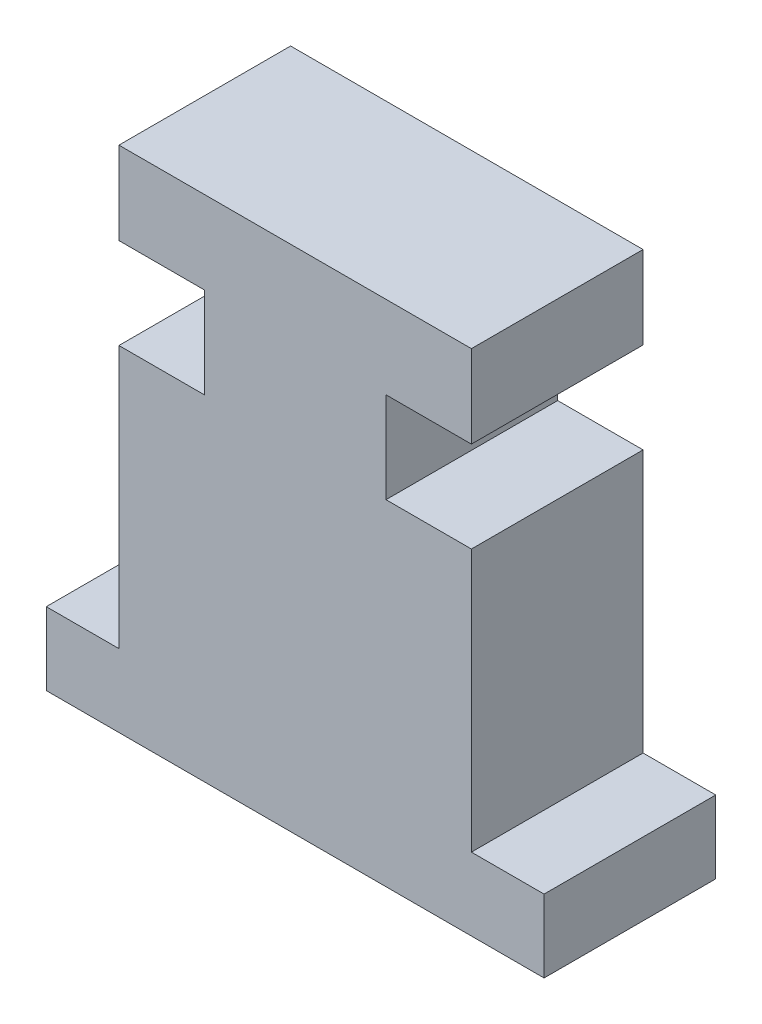
ISO-10303-21;
HEADER;
FILE_DESCRIPTION(('STEP AP214'),'2;1');
FILE_NAME('part.step','',(''),(''),'','','');
FILE_SCHEMA(('AUTOMOTIVE_DESIGN { 1 0 10303 214 1 1 1 1 }'));
ENDSEC;
DATA;
#1=APPLICATION_CONTEXT('core data for automotive mechanical design processes');
#2=APPLICATION_PROTOCOL_DEFINITION('international standard','automotive_design',2000,#1);
#3=PRODUCT_CONTEXT('',#1,'mechanical');
#4=PRODUCT('Part','Part','',(#3));
#5=PRODUCT_RELATED_PRODUCT_CATEGORY('part','',(#4));
#6=PRODUCT_DEFINITION_FORMATION('','',#4);
#7=PRODUCT_DEFINITION_CONTEXT('part definition',#1,'design');
#8=PRODUCT_DEFINITION('design','',#6,#7);
#9=PRODUCT_DEFINITION_SHAPE('','',#8);
#10=(LENGTH_UNIT() NAMED_UNIT(*) SI_UNIT(.MILLI.,.METRE.));
#11=(NAMED_UNIT(*) PLANE_ANGLE_UNIT() SI_UNIT($,.RADIAN.));
#12=(NAMED_UNIT(*) SI_UNIT($,.STERADIAN.) SOLID_ANGLE_UNIT());
#13=UNCERTAINTY_MEASURE_WITH_UNIT(LENGTH_MEASURE(1.E-05),#10,'distance_accuracy_value','');
#14=(GEOMETRIC_REPRESENTATION_CONTEXT(3) GLOBAL_UNCERTAINTY_ASSIGNED_CONTEXT((#13)) GLOBAL_UNIT_ASSIGNED_CONTEXT((#10,
#11,#12)) REPRESENTATION_CONTEXT('',''));
#15=CARTESIAN_POINT('',(0.,0.,0.));
#16=DIRECTION('',(0.,0.,1.));
#17=DIRECTION('',(1.,0.,0.));
#18=AXIS2_PLACEMENT_3D('',#15,#16,#17);
#19=CARTESIAN_POINT('',(6.1595,15.24,0.));
#20=DIRECTION('',(1.,0.,0.));
#21=DIRECTION('',(0.,0.,-1.));
#22=AXIS2_PLACEMENT_3D('',#19,#20,#21);
#23=PLANE('',#22);
#24=DIRECTION('',(0.,-1.,0.));
#25=VECTOR('',#24,1.);
#26=CARTESIAN_POINT('',(6.1595,15.24,3.));
#27=LINE('',#26,#25);
#28=CARTESIAN_POINT('',(6.1595,15.24,3.));
#29=VERTEX_POINT('',#28);
#30=CARTESIAN_POINT('',(6.1595,12.35,3.));
#31=VERTEX_POINT('',#30);
#32=EDGE_CURVE('E308',#29,#31,#27,.T.);
#33=ORIENTED_EDGE('',*,*,#32,.T.);
#34=DIRECTION('',(0.,0.,-1.));
#35=VECTOR('',#34,1.);
#36=CARTESIAN_POINT('',(6.1595,12.35,3.));
#37=LINE('',#36,#35);
#38=CARTESIAN_POINT('',(6.1595,12.35,-3.));
#39=VERTEX_POINT('',#38);
#40=EDGE_CURVE('E73',#31,#39,#37,.T.);
#41=ORIENTED_EDGE('',*,*,#40,.T.);
#42=DIRECTION('',(0.,-1.,0.));
#43=VECTOR('',#42,1.);
#44=CARTESIAN_POINT('',(6.1595,15.24,-3.));
#45=LINE('',#44,#43);
#46=CARTESIAN_POINT('',(6.1595,15.24,-3.));
#47=VERTEX_POINT('',#46);
#48=EDGE_CURVE('E11',#47,#39,#45,.T.);
#49=ORIENTED_EDGE('',*,*,#48,.F.);
#50=DIRECTION('',(0.,0.,1.));
#51=VECTOR('',#50,1.);
#52=CARTESIAN_POINT('',(6.1595,15.24,0.));
#53=LINE('',#52,#51);
#54=EDGE_CURVE('E286',#47,#29,#53,.T.);
#55=ORIENTED_EDGE('',*,*,#54,.T.);
#56=EDGE_LOOP('',(#33,#41,#49,#55));
#57=FACE_BOUND('',#56,.T.);
#58=ADVANCED_FACE('F49',(#57),#23,.T.);
#59=CARTESIAN_POINT('',(0.,15.24,-3.));
#60=DIRECTION('',(0.,0.,-1.));
#61=DIRECTION('',(-1.,0.,0.));
#62=AXIS2_PLACEMENT_3D('',#59,#60,#61);
#63=PLANE('',#62);
#64=DIRECTION('',(-1.,0.,0.));
#65=VECTOR('',#64,1.);
#66=CARTESIAN_POINT('',(0.,9.175,-3.));
#67=LINE('',#66,#65);
#68=CARTESIAN_POINT('',(6.1595,9.175,-3.));
#69=VERTEX_POINT('',#68);
#70=CARTESIAN_POINT('',(3.175,9.175,-3.));
#71=VERTEX_POINT('',#70);
#72=EDGE_CURVE('E185',#69,#71,#67,.T.);
#73=ORIENTED_EDGE('',*,*,#72,.F.);
#74=CARTESIAN_POINT('',(6.1595,0.,-3.));
#75=VERTEX_POINT('',#74);
#76=EDGE_CURVE('E58',#69,#75,#45,.T.);
#77=ORIENTED_EDGE('',*,*,#76,.T.);
#78=DIRECTION('',(1.,0.,0.));
#79=VECTOR('',#78,1.);
#80=CARTESIAN_POINT('',(0.,0.,-3.));
#81=LINE('',#80,#79);
#82=CARTESIAN_POINT('',(8.6995,0.,-3.));
#83=VERTEX_POINT('',#82);
#84=EDGE_CURVE('E264',#75,#83,#81,.T.);
#85=ORIENTED_EDGE('',*,*,#84,.T.);
#86=DIRECTION('',(0.,1.,0.));
#87=VECTOR('',#86,1.);
#88=CARTESIAN_POINT('',(8.6995,-2.54,-3.));
#89=LINE('',#88,#87);
#90=CARTESIAN_POINT('',(8.6995,-2.54,-3.));
#91=VERTEX_POINT('',#90);
#92=EDGE_CURVE('E279',#91,#83,#89,.T.);
#93=ORIENTED_EDGE('',*,*,#92,.F.);
#94=DIRECTION('',(1.,0.,0.));
#95=VECTOR('',#94,1.);
#96=CARTESIAN_POINT('',(0.,-2.54,-3.));
#97=LINE('',#96,#95);
#98=CARTESIAN_POINT('',(-8.6995,-2.54,-3.));
#99=VERTEX_POINT('',#98);
#100=EDGE_CURVE('E248',#99,#91,#97,.T.);
#101=ORIENTED_EDGE('',*,*,#100,.F.);
#102=DIRECTION('',(0.,1.,0.));
#103=VECTOR('',#102,1.);
#104=CARTESIAN_POINT('',(-8.6995,-2.54,-3.));
#105=LINE('',#104,#103);
#106=CARTESIAN_POINT('',(-8.6995,0.,-3.));
#107=VERTEX_POINT('',#106);
#108=EDGE_CURVE('E276',#99,#107,#105,.T.);
#109=ORIENTED_EDGE('',*,*,#108,.T.);
#110=CARTESIAN_POINT('',(-6.1595,0.,-3.));
#111=VERTEX_POINT('',#110);
#112=EDGE_CURVE('E265',#107,#111,#81,.T.);
#113=ORIENTED_EDGE('',*,*,#112,.T.);
#114=DIRECTION('',(0.,-1.,0.));
#115=VECTOR('',#114,1.);
#116=CARTESIAN_POINT('',(-6.1595,15.24,-3.));
#117=LINE('',#116,#115);
#118=CARTESIAN_POINT('',(-6.1595,9.175,-3.));
#119=VERTEX_POINT('',#118);
#120=EDGE_CURVE('E315',#119,#111,#117,.T.);
#121=ORIENTED_EDGE('',*,*,#120,.F.);
#122=DIRECTION('',(-1.,0.,0.));
#123=VECTOR('',#122,1.);
#124=CARTESIAN_POINT('',(0.,9.175,-3.));
#125=LINE('',#124,#123);
#126=CARTESIAN_POINT('',(-3.175,9.175,-3.));
#127=VERTEX_POINT('',#126);
#128=EDGE_CURVE('E212',#127,#119,#125,.T.);
#129=ORIENTED_EDGE('',*,*,#128,.F.);
#130=DIRECTION('',(0.,-1.,0.));
#131=VECTOR('',#130,1.);
#132=CARTESIAN_POINT('',(-3.17500000000001,0.,-3.));
#133=LINE('',#132,#131);
#134=CARTESIAN_POINT('',(-3.175,12.35,-3.));
#135=VERTEX_POINT('',#134);
#136=EDGE_CURVE('E223',#135,#127,#133,.T.);
#137=ORIENTED_EDGE('',*,*,#136,.F.);
#138=DIRECTION('',(-1.,0.,0.));
#139=VECTOR('',#138,1.);
#140=CARTESIAN_POINT('',(0.,12.35,-3.));
#141=LINE('',#140,#139);
#142=CARTESIAN_POINT('',(-6.1595,12.35,-3.));
#143=VERTEX_POINT('',#142);
#144=EDGE_CURVE('E219',#135,#143,#141,.T.);
#145=ORIENTED_EDGE('',*,*,#144,.T.);
#146=CARTESIAN_POINT('',(-6.1595,15.24,-3.));
#147=VERTEX_POINT('',#146);
#148=EDGE_CURVE('E316',#147,#143,#117,.T.);
#149=ORIENTED_EDGE('',*,*,#148,.F.);
#150=DIRECTION('',(1.,0.,0.));
#151=VECTOR('',#150,1.);
#152=CARTESIAN_POINT('',(0.,15.24,-3.));
#153=LINE('',#152,#151);
#154=EDGE_CURVE('E290',#147,#47,#153,.T.);
#155=ORIENTED_EDGE('',*,*,#154,.T.);
#156=ORIENTED_EDGE('',*,*,#48,.T.);
#157=DIRECTION('',(-1.,0.,0.));
#158=VECTOR('',#157,1.);
#159=CARTESIAN_POINT('',(0.,12.35,-3.));
#160=LINE('',#159,#158);
#161=CARTESIAN_POINT('',(3.175,12.35,-3.));
#162=VERTEX_POINT('',#161);
#163=EDGE_CURVE('E189',#39,#162,#160,.T.);
#164=ORIENTED_EDGE('',*,*,#163,.T.);
#165=DIRECTION('',(0.,-1.,0.));
#166=VECTOR('',#165,1.);
#167=CARTESIAN_POINT('',(3.175,0.,-3.));
#168=LINE('',#167,#166);
#169=EDGE_CURVE('E177',#162,#71,#168,.T.);
#170=ORIENTED_EDGE('',*,*,#169,.T.);
#171=EDGE_LOOP('',(#73,#77,#85,#93,#101,#109,#113,#121,#129,#137,#145,#149,#155,#156,#164,#170));
#172=FACE_BOUND('',#171,.T.);
#173=ADVANCED_FACE('F337',(#172),#63,.T.);
#174=CARTESIAN_POINT('',(-6.1595,15.24,0.));
#175=DIRECTION('',(1.,0.,0.));
#176=DIRECTION('',(0.,0.,-1.));
#177=AXIS2_PLACEMENT_3D('',#174,#175,#176);
#178=PLANE('',#177);
#179=DIRECTION('',(0.,0.,-1.));
#180=VECTOR('',#179,1.);
#181=CARTESIAN_POINT('',(-6.1595,12.35,3.));
#182=LINE('',#181,#180);
#183=CARTESIAN_POINT('',(-6.1595,12.35,3.));
#184=VERTEX_POINT('',#183);
#185=EDGE_CURVE('E196',#184,#143,#182,.T.);
#186=ORIENTED_EDGE('',*,*,#185,.F.);
#187=DIRECTION('',(0.,-1.,0.));
#188=VECTOR('',#187,1.);
#189=CARTESIAN_POINT('',(-6.1595,15.24,3.));
#190=LINE('',#189,#188);
#191=CARTESIAN_POINT('',(-6.1595,15.24,3.));
#192=VERTEX_POINT('',#191);
#193=EDGE_CURVE('E312',#192,#184,#190,.T.);
#194=ORIENTED_EDGE('',*,*,#193,.F.);
#195=DIRECTION('',(0.,0.,1.));
#196=VECTOR('',#195,1.);
#197=CARTESIAN_POINT('',(-6.1595,15.24,0.));
#198=LINE('',#197,#196);
#199=EDGE_CURVE('E295',#147,#192,#198,.T.);
#200=ORIENTED_EDGE('',*,*,#199,.F.);
#201=ORIENTED_EDGE('',*,*,#148,.T.);
#202=EDGE_LOOP('',(#186,#194,#200,#201));
#203=FACE_BOUND('',#202,.T.);
#204=ADVANCED_FACE('F371',(#203),#178,.F.);
#205=CARTESIAN_POINT('',(0.,15.24,3.));
#206=DIRECTION('',(0.,0.,-1.));
#207=DIRECTION('',(-1.,0.,0.));
#208=AXIS2_PLACEMENT_3D('',#205,#206,#207);
#209=PLANE('',#208);
#210=CARTESIAN_POINT('',(6.1595,9.175,3.));
#211=VERTEX_POINT('',#210);
#212=CARTESIAN_POINT('',(6.1595,0.,3.));
#213=VERTEX_POINT('',#212);
#214=EDGE_CURVE('E301',#211,#213,#27,.T.);
#215=ORIENTED_EDGE('',*,*,#214,.F.);
#216=DIRECTION('',(-1.,0.,0.));
#217=VECTOR('',#216,1.);
#218=CARTESIAN_POINT('',(0.,9.175,3.));
#219=LINE('',#218,#217);
#220=CARTESIAN_POINT('',(3.175,9.175,3.));
#221=VERTEX_POINT('',#220);
#222=EDGE_CURVE('E170',#211,#221,#219,.T.);
#223=ORIENTED_EDGE('',*,*,#222,.T.);
#224=DIRECTION('',(0.,-1.,0.));
#225=VECTOR('',#224,1.);
#226=CARTESIAN_POINT('',(3.175,0.,3.));
#227=LINE('',#226,#225);
#228=CARTESIAN_POINT('',(3.175,12.35,3.));
#229=VERTEX_POINT('',#228);
#230=EDGE_CURVE('E171',#229,#221,#227,.T.);
#231=ORIENTED_EDGE('',*,*,#230,.F.);
#232=DIRECTION('',(-1.,0.,0.));
#233=VECTOR('',#232,1.);
#234=CARTESIAN_POINT('',(0.,12.35,3.));
#235=LINE('',#234,#233);
#236=EDGE_CURVE('E160',#31,#229,#235,.T.);
#237=ORIENTED_EDGE('',*,*,#236,.F.);
#238=ORIENTED_EDGE('',*,*,#32,.F.);
#239=DIRECTION('',(1.,0.,0.));
#240=VECTOR('',#239,1.);
#241=CARTESIAN_POINT('',(0.,15.24,3.));
#242=LINE('',#241,#240);
#243=EDGE_CURVE('E298',#192,#29,#242,.T.);
#244=ORIENTED_EDGE('',*,*,#243,.F.);
#245=ORIENTED_EDGE('',*,*,#193,.T.);
#246=DIRECTION('',(-1.,0.,0.));
#247=VECTOR('',#246,1.);
#248=CARTESIAN_POINT('',(0.,12.35,3.));
#249=LINE('',#248,#247);
#250=CARTESIAN_POINT('',(-3.175,12.35,3.));
#251=VERTEX_POINT('',#250);
#252=EDGE_CURVE('E208',#251,#184,#249,.T.);
#253=ORIENTED_EDGE('',*,*,#252,.F.);
#254=DIRECTION('',(0.,-1.,0.));
#255=VECTOR('',#254,1.);
#256=CARTESIAN_POINT('',(-3.17500000000001,0.,3.));
#257=LINE('',#256,#255);
#258=CARTESIAN_POINT('',(-3.175,9.175,3.));
#259=VERTEX_POINT('',#258);
#260=EDGE_CURVE('E211',#251,#259,#257,.T.);
#261=ORIENTED_EDGE('',*,*,#260,.T.);
#262=DIRECTION('',(-1.,0.,0.));
#263=VECTOR('',#262,1.);
#264=CARTESIAN_POINT('',(0.,9.175,3.));
#265=LINE('',#264,#263);
#266=CARTESIAN_POINT('',(-6.1595,9.175,3.));
#267=VERTEX_POINT('',#266);
#268=EDGE_CURVE('E65',#259,#267,#265,.T.);
#269=ORIENTED_EDGE('',*,*,#268,.T.);
#270=CARTESIAN_POINT('',(-6.1595,0.,3.));
#271=VERTEX_POINT('',#270);
#272=EDGE_CURVE('E311',#267,#271,#190,.T.);
#273=ORIENTED_EDGE('',*,*,#272,.T.);
#274=DIRECTION('',(1.,0.,0.));
#275=VECTOR('',#274,1.);
#276=CARTESIAN_POINT('',(0.,0.,3.));
#277=LINE('',#276,#275);
#278=CARTESIAN_POINT('',(-8.6995,0.,3.));
#279=VERTEX_POINT('',#278);
#280=EDGE_CURVE('E256',#279,#271,#277,.T.);
#281=ORIENTED_EDGE('',*,*,#280,.F.);
#282=DIRECTION('',(0.,1.,0.));
#283=VECTOR('',#282,1.);
#284=CARTESIAN_POINT('',(-8.6995,-2.54,3.));
#285=LINE('',#284,#283);
#286=CARTESIAN_POINT('',(-8.6995,-2.54,3.));
#287=VERTEX_POINT('',#286);
#288=EDGE_CURVE('E272',#287,#279,#285,.T.);
#289=ORIENTED_EDGE('',*,*,#288,.F.);
#290=DIRECTION('',(1.,0.,0.));
#291=VECTOR('',#290,1.);
#292=CARTESIAN_POINT('',(0.,-2.54,3.));
#293=LINE('',#292,#291);
#294=CARTESIAN_POINT('',(8.6995,-2.54,3.));
#295=VERTEX_POINT('',#294);
#296=EDGE_CURVE('E240',#287,#295,#293,.T.);
#297=ORIENTED_EDGE('',*,*,#296,.T.);
#298=DIRECTION('',(0.,1.,0.));
#299=VECTOR('',#298,1.);
#300=CARTESIAN_POINT('',(8.6995,-2.54,3.));
#301=LINE('',#300,#299);
#302=CARTESIAN_POINT('',(8.6995,0.,3.));
#303=VERTEX_POINT('',#302);
#304=EDGE_CURVE('E255',#295,#303,#301,.T.);
#305=ORIENTED_EDGE('',*,*,#304,.T.);
#306=EDGE_CURVE('E202',#213,#303,#277,.T.);
#307=ORIENTED_EDGE('',*,*,#306,.F.);
#308=EDGE_LOOP('',(#215,#223,#231,#237,#238,#244,#245,#253,#261,#269,#273,#281,#289,#297,#305,#307));
#309=FACE_BOUND('',#308,.T.);
#310=ADVANCED_FACE('F183',(#309),#209,.F.);
#311=DIRECTION('',(0.,0.,-1.));
#312=VECTOR('',#311,1.);
#313=CARTESIAN_POINT('',(6.1595,9.175,3.));
#314=LINE('',#313,#312);
#315=EDGE_CURVE('E203',#211,#69,#314,.T.);
#316=ORIENTED_EDGE('',*,*,#315,.F.);
#317=ORIENTED_EDGE('',*,*,#214,.T.);
#318=DIRECTION('',(0.,0.,1.));
#319=VECTOR('',#318,1.);
#320=CARTESIAN_POINT('',(6.1595,0.,0.));
#321=LINE('',#320,#319);
#322=EDGE_CURVE('E275',#75,#213,#321,.T.);
#323=ORIENTED_EDGE('',*,*,#322,.F.);
#324=ORIENTED_EDGE('',*,*,#76,.F.);
#325=EDGE_LOOP('',(#316,#317,#323,#324));
#326=FACE_BOUND('',#325,.T.);
#327=ADVANCED_FACE('F51',(#326),#23,.T.);
#328=ORIENTED_EDGE('',*,*,#272,.F.);
#329=DIRECTION('',(0.,0.,-1.));
#330=VECTOR('',#329,1.);
#331=CARTESIAN_POINT('',(-6.1595,9.175,3.));
#332=LINE('',#331,#330);
#333=EDGE_CURVE('E231',#267,#119,#332,.T.);
#334=ORIENTED_EDGE('',*,*,#333,.T.);
#335=ORIENTED_EDGE('',*,*,#120,.T.);
#336=DIRECTION('',(0.,0.,1.));
#337=VECTOR('',#336,1.);
#338=CARTESIAN_POINT('',(-6.1595,0.,0.));
#339=LINE('',#338,#337);
#340=EDGE_CURVE('E291',#111,#271,#339,.T.);
#341=ORIENTED_EDGE('',*,*,#340,.T.);
#342=EDGE_LOOP('',(#328,#334,#335,#341));
#343=FACE_BOUND('',#342,.T.);
#344=ADVANCED_FACE('F328',(#343),#178,.F.);
#345=CARTESIAN_POINT('',(0.,15.24,0.));
#346=DIRECTION('',(0.,1.,0.));
#347=DIRECTION('',(0.,0.,1.));
#348=AXIS2_PLACEMENT_3D('',#345,#346,#347);
#349=PLANE('',#348);
#350=ORIENTED_EDGE('',*,*,#54,.F.);
#351=ORIENTED_EDGE('',*,*,#154,.F.);
#352=ORIENTED_EDGE('',*,*,#199,.T.);
#353=ORIENTED_EDGE('',*,*,#243,.T.);
#354=EDGE_LOOP('',(#350,#351,#352,#353));
#355=FACE_BOUND('',#354,.T.);
#356=ADVANCED_FACE('F369',(#355),#349,.T.);
#357=CARTESIAN_POINT('',(0.,0.,0.));
#358=DIRECTION('',(0.,1.,0.));
#359=DIRECTION('',(0.,0.,1.));
#360=AXIS2_PLACEMENT_3D('',#357,#358,#359);
#361=PLANE('',#360);
#362=ORIENTED_EDGE('',*,*,#340,.F.);
#363=ORIENTED_EDGE('',*,*,#112,.F.);
#364=DIRECTION('',(0.,0.,1.));
#365=VECTOR('',#364,1.);
#366=CARTESIAN_POINT('',(-8.6995,0.,0.));
#367=LINE('',#366,#365);
#368=EDGE_CURVE('E245',#107,#279,#367,.T.);
#369=ORIENTED_EDGE('',*,*,#368,.T.);
#370=ORIENTED_EDGE('',*,*,#280,.T.);
#371=EDGE_LOOP('',(#362,#363,#369,#370));
#372=FACE_BOUND('',#371,.T.);
#373=ADVANCED_FACE('F333',(#372),#361,.T.);
#374=CARTESIAN_POINT('',(-8.6995,-2.54,0.));
#375=DIRECTION('',(-1.,0.,0.));
#376=DIRECTION('',(0.,0.,1.));
#377=AXIS2_PLACEMENT_3D('',#374,#375,#376);
#378=PLANE('',#377);
#379=ORIENTED_EDGE('',*,*,#368,.F.);
#380=ORIENTED_EDGE('',*,*,#108,.F.);
#381=DIRECTION('',(0.,0.,1.));
#382=VECTOR('',#381,1.);
#383=CARTESIAN_POINT('',(-8.6995,-2.54,0.));
#384=LINE('',#383,#382);
#385=EDGE_CURVE('E251',#99,#287,#384,.T.);
#386=ORIENTED_EDGE('',*,*,#385,.T.);
#387=ORIENTED_EDGE('',*,*,#288,.T.);
#388=EDGE_LOOP('',(#379,#380,#386,#387));
#389=FACE_BOUND('',#388,.T.);
#390=ADVANCED_FACE('F342',(#389),#378,.T.);
#391=CARTESIAN_POINT('',(8.6995,-2.54,0.));
#392=DIRECTION('',(-1.,0.,0.));
#393=DIRECTION('',(0.,0.,1.));
#394=AXIS2_PLACEMENT_3D('',#391,#392,#393);
#395=PLANE('',#394);
#396=DIRECTION('',(0.,0.,1.));
#397=VECTOR('',#396,1.);
#398=CARTESIAN_POINT('',(8.6995,0.,0.));
#399=LINE('',#398,#397);
#400=EDGE_CURVE('E260',#83,#303,#399,.T.);
#401=ORIENTED_EDGE('',*,*,#400,.T.);
#402=ORIENTED_EDGE('',*,*,#304,.F.);
#403=DIRECTION('',(0.,0.,1.));
#404=VECTOR('',#403,1.);
#405=CARTESIAN_POINT('',(8.6995,-2.54,0.));
#406=LINE('',#405,#404);
#407=EDGE_CURVE('E244',#91,#295,#406,.T.);
#408=ORIENTED_EDGE('',*,*,#407,.F.);
#409=ORIENTED_EDGE('',*,*,#92,.T.);
#410=EDGE_LOOP('',(#401,#402,#408,#409));
#411=FACE_BOUND('',#410,.T.);
#412=ADVANCED_FACE('F357',(#411),#395,.F.);
#413=CARTESIAN_POINT('',(0.,-2.54,0.));
#414=DIRECTION('',(0.,1.,0.));
#415=DIRECTION('',(0.,0.,1.));
#416=AXIS2_PLACEMENT_3D('',#413,#414,#415);
#417=PLANE('',#416);
#418=ORIENTED_EDGE('',*,*,#296,.F.);
#419=ORIENTED_EDGE('',*,*,#385,.F.);
#420=ORIENTED_EDGE('',*,*,#100,.T.);
#421=ORIENTED_EDGE('',*,*,#407,.T.);
#422=EDGE_LOOP('',(#418,#419,#420,#421));
#423=FACE_BOUND('',#422,.T.);
#424=ADVANCED_FACE('F409',(#423),#417,.F.);
#425=ORIENTED_EDGE('',*,*,#84,.F.);
#426=ORIENTED_EDGE('',*,*,#322,.T.);
#427=ORIENTED_EDGE('',*,*,#306,.T.);
#428=ORIENTED_EDGE('',*,*,#400,.F.);
#429=EDGE_LOOP('',(#425,#426,#427,#428));
#430=FACE_BOUND('',#429,.T.);
#431=ADVANCED_FACE('F352',(#430),#361,.T.);
#432=CARTESIAN_POINT('',(0.,12.35,3.));
#433=DIRECTION('',(0.,-1.,0.));
#434=DIRECTION('',(0.,0.,-1.));
#435=AXIS2_PLACEMENT_3D('',#432,#433,#434);
#436=PLANE('',#435);
#437=ORIENTED_EDGE('',*,*,#144,.F.);
#438=DIRECTION('',(0.,0.,-1.));
#439=VECTOR('',#438,1.);
#440=CARTESIAN_POINT('',(-3.175,12.35,3.));
#441=LINE('',#440,#439);
#442=EDGE_CURVE('E218',#251,#135,#441,.T.);
#443=ORIENTED_EDGE('',*,*,#442,.F.);
#444=ORIENTED_EDGE('',*,*,#252,.T.);
#445=ORIENTED_EDGE('',*,*,#185,.T.);
#446=EDGE_LOOP('',(#437,#443,#444,#445));
#447=FACE_BOUND('',#446,.T.);
#448=ADVANCED_FACE('F374',(#447),#436,.T.);
#449=CARTESIAN_POINT('',(0.,9.175,3.));
#450=DIRECTION('',(0.,-1.,0.));
#451=DIRECTION('',(0.,0.,-1.));
#452=AXIS2_PLACEMENT_3D('',#449,#450,#451);
#453=PLANE('',#452);
#454=ORIENTED_EDGE('',*,*,#128,.T.);
#455=ORIENTED_EDGE('',*,*,#333,.F.);
#456=ORIENTED_EDGE('',*,*,#268,.F.);
#457=DIRECTION('',(0.,0.,-1.));
#458=VECTOR('',#457,1.);
#459=CARTESIAN_POINT('',(-3.175,9.175,3.));
#460=LINE('',#459,#458);
#461=EDGE_CURVE('E235',#259,#127,#460,.T.);
#462=ORIENTED_EDGE('',*,*,#461,.T.);
#463=EDGE_LOOP('',(#454,#455,#456,#462));
#464=FACE_BOUND('',#463,.T.);
#465=ADVANCED_FACE('F379',(#464),#453,.F.);
#466=CARTESIAN_POINT('',(-3.17500000000001,0.,3.));
#467=DIRECTION('',(1.,0.,0.));
#468=DIRECTION('',(0.,1.,0.));
#469=AXIS2_PLACEMENT_3D('',#466,#467,#468);
#470=PLANE('',#469);
#471=ORIENTED_EDGE('',*,*,#136,.T.);
#472=ORIENTED_EDGE('',*,*,#461,.F.);
#473=ORIENTED_EDGE('',*,*,#260,.F.);
#474=ORIENTED_EDGE('',*,*,#442,.T.);
#475=EDGE_LOOP('',(#471,#472,#473,#474));
#476=FACE_BOUND('',#475,.T.);
#477=ADVANCED_FACE('F377',(#476),#470,.F.);
#478=CARTESIAN_POINT('',(3.175,0.,3.));
#479=DIRECTION('',(1.,0.,0.));
#480=DIRECTION('',(0.,1.,0.));
#481=AXIS2_PLACEMENT_3D('',#478,#479,#480);
#482=PLANE('',#481);
#483=ORIENTED_EDGE('',*,*,#169,.F.);
#484=DIRECTION('',(0.,0.,-1.));
#485=VECTOR('',#484,1.);
#486=CARTESIAN_POINT('',(3.175,12.35,3.));
#487=LINE('',#486,#485);
#488=EDGE_CURVE('E163',#229,#162,#487,.T.);
#489=ORIENTED_EDGE('',*,*,#488,.F.);
#490=ORIENTED_EDGE('',*,*,#230,.T.);
#491=DIRECTION('',(0.,0.,-1.));
#492=VECTOR('',#491,1.);
#493=CARTESIAN_POINT('',(3.175,9.175,3.));
#494=LINE('',#493,#492);
#495=EDGE_CURVE('E199',#221,#71,#494,.T.);
#496=ORIENTED_EDGE('',*,*,#495,.T.);
#497=EDGE_LOOP('',(#483,#489,#490,#496));
#498=FACE_BOUND('',#497,.T.);
#499=ADVANCED_FACE('F174',(#498),#482,.T.);
#500=CARTESIAN_POINT('',(0.,9.175,3.));
#501=DIRECTION('',(0.,-1.,0.));
#502=DIRECTION('',(0.,0.,-1.));
#503=AXIS2_PLACEMENT_3D('',#500,#501,#502);
#504=PLANE('',#503);
#505=ORIENTED_EDGE('',*,*,#72,.T.);
#506=ORIENTED_EDGE('',*,*,#495,.F.);
#507=ORIENTED_EDGE('',*,*,#222,.F.);
#508=ORIENTED_EDGE('',*,*,#315,.T.);
#509=EDGE_LOOP('',(#505,#506,#507,#508));
#510=FACE_BOUND('',#509,.T.);
#511=ADVANCED_FACE('F362',(#510),#504,.F.);
#512=CARTESIAN_POINT('',(0.,12.35,3.));
#513=DIRECTION('',(0.,-1.,0.));
#514=DIRECTION('',(0.,0.,-1.));
#515=AXIS2_PLACEMENT_3D('',#512,#513,#514);
#516=PLANE('',#515);
#517=ORIENTED_EDGE('',*,*,#163,.F.);
#518=ORIENTED_EDGE('',*,*,#40,.F.);
#519=ORIENTED_EDGE('',*,*,#236,.T.);
#520=ORIENTED_EDGE('',*,*,#488,.T.);
#521=EDGE_LOOP('',(#517,#518,#519,#520));
#522=FACE_BOUND('',#521,.T.);
#523=ADVANCED_FACE('F162',(#522),#516,.T.);
#524=CLOSED_SHELL('',(#58,#173,#204,#310,#327,#344,#356,#373,#390,#412,#424,#431,#448,#465,#477,
#499,#511,#523));
#525=MANIFOLD_SOLID_BREP('B2',#524);
#526=ADVANCED_BREP_SHAPE_REPRESENTATION('',(#18,#525),#14);
#527=SHAPE_DEFINITION_REPRESENTATION(#9,#526);
ENDSEC;
END-ISO-10303-21;
